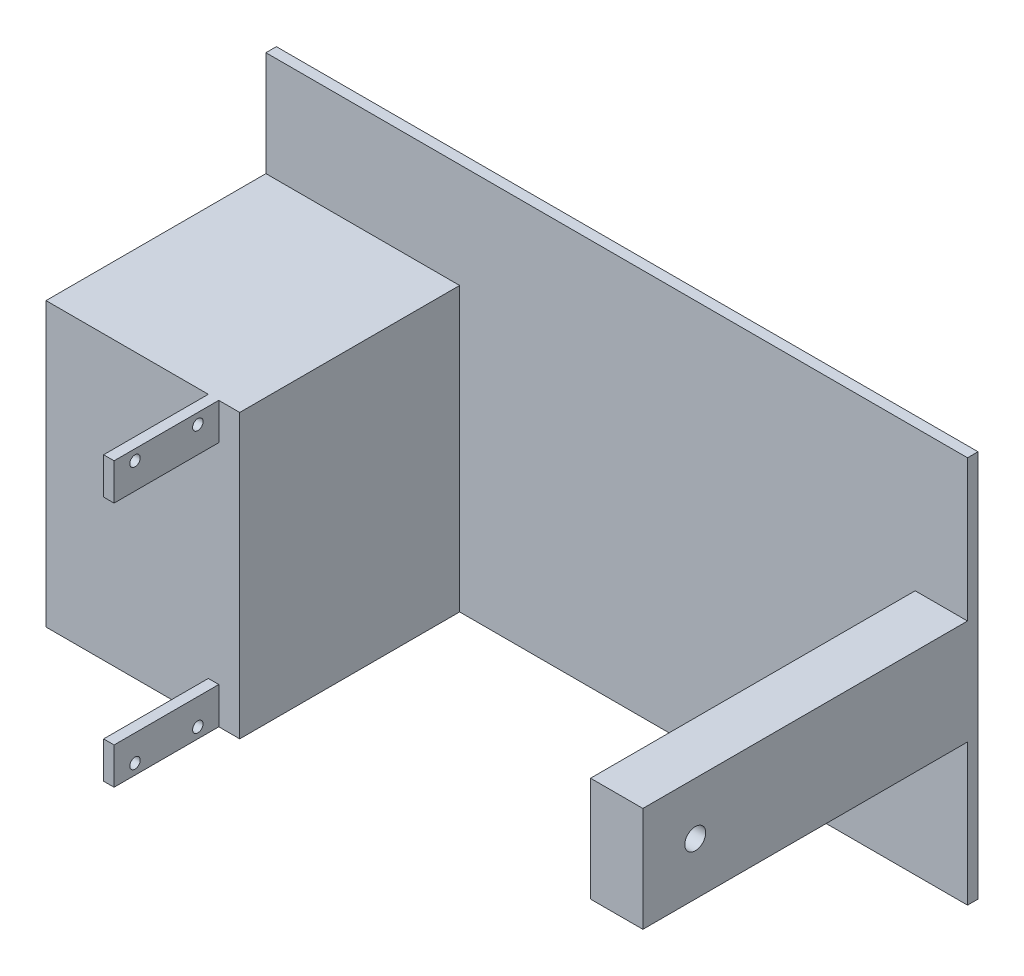
ISO-10303-21;
HEADER;
FILE_DESCRIPTION(('STEP AP214'),'2;1');
FILE_NAME('part.step','',(''),(''),'','','');
FILE_SCHEMA(('AUTOMOTIVE_DESIGN { 1 0 10303 214 1 1 1 1 }'));
ENDSEC;
DATA;
#1=APPLICATION_CONTEXT('core data for automotive mechanical design processes');
#2=APPLICATION_PROTOCOL_DEFINITION('international standard','automotive_design',2000,#1);
#3=PRODUCT_CONTEXT('',#1,'mechanical');
#4=PRODUCT('Part','Part','',(#3));
#5=PRODUCT_RELATED_PRODUCT_CATEGORY('part','',(#4));
#6=PRODUCT_DEFINITION_FORMATION('','',#4);
#7=PRODUCT_DEFINITION_CONTEXT('part definition',#1,'design');
#8=PRODUCT_DEFINITION('design','',#6,#7);
#9=PRODUCT_DEFINITION_SHAPE('','',#8);
#10=(LENGTH_UNIT() NAMED_UNIT(*) SI_UNIT(.MILLI.,.METRE.));
#11=(NAMED_UNIT(*) PLANE_ANGLE_UNIT() SI_UNIT($,.RADIAN.));
#12=(NAMED_UNIT(*) SI_UNIT($,.STERADIAN.) SOLID_ANGLE_UNIT());
#13=UNCERTAINTY_MEASURE_WITH_UNIT(LENGTH_MEASURE(1.E-05),#10,'distance_accuracy_value','');
#14=(GEOMETRIC_REPRESENTATION_CONTEXT(3) GLOBAL_UNCERTAINTY_ASSIGNED_CONTEXT((#13)) GLOBAL_UNIT_ASSIGNED_CONTEXT((#10,
#11,#12)) REPRESENTATION_CONTEXT('',''));
#15=CARTESIAN_POINT('',(0.,0.,0.));
#16=DIRECTION('',(0.,0.,1.));
#17=DIRECTION('',(1.,0.,0.));
#18=AXIS2_PLACEMENT_3D('',#15,#16,#17);
#19=CARTESIAN_POINT('',(0.,0.,-40.));
#20=DIRECTION('',(0.,0.,-1.));
#21=DIRECTION('',(-1.,0.,0.));
#22=AXIS2_PLACEMENT_3D('',#19,#20,#21);
#23=PLANE('',#22);
#24=DIRECTION('',(1.,0.,0.));
#25=VECTOR('',#24,1.);
#26=CARTESIAN_POINT('',(115.5,0.,-40.));
#27=LINE('',#26,#25);
#28=CARTESIAN_POINT('',(105.5,0.,-40.));
#29=VERTEX_POINT('',#28);
#30=CARTESIAN_POINT('',(115.5,0.,-40.));
#31=VERTEX_POINT('',#30);
#32=EDGE_CURVE('E763',#29,#31,#27,.T.);
#33=ORIENTED_EDGE('',*,*,#32,.F.);
#34=DIRECTION('',(0.,-1.,0.));
#35=VECTOR('',#34,1.);
#36=CARTESIAN_POINT('',(105.5,0.,-40.));
#37=LINE('',#36,#35);
#38=CARTESIAN_POINT('',(105.5,20.,-40.));
#39=VERTEX_POINT('',#38);
#40=EDGE_CURVE('E209',#39,#29,#37,.T.);
#41=ORIENTED_EDGE('',*,*,#40,.F.);
#42=DIRECTION('',(-1.,0.,0.));
#43=VECTOR('',#42,1.);
#44=CARTESIAN_POINT('',(115.5,20.,-40.));
#45=LINE('',#44,#43);
#46=CARTESIAN_POINT('',(115.5,20.,-40.));
#47=VERTEX_POINT('',#46);
#48=EDGE_CURVE('E205',#47,#39,#45,.T.);
#49=ORIENTED_EDGE('',*,*,#48,.F.);
#50=DIRECTION('',(0.,-1.,0.));
#51=VECTOR('',#50,1.);
#52=CARTESIAN_POINT('',(115.5,-27.,-40.));
#53=LINE('',#52,#51);
#54=CARTESIAN_POINT('',(115.5,47.,-40.));
#55=VERTEX_POINT('',#54);
#56=EDGE_CURVE('E233',#55,#47,#53,.T.);
#57=ORIENTED_EDGE('',*,*,#56,.F.);
#58=DIRECTION('',(1.,0.,0.));
#59=VECTOR('',#58,1.);
#60=CARTESIAN_POINT('',(-18.5,47.,-40.));
#61=LINE('',#60,#59);
#62=CARTESIAN_POINT('',(-18.5,47.,-40.));
#63=VERTEX_POINT('',#62);
#64=EDGE_CURVE('E213',#63,#55,#61,.T.);
#65=ORIENTED_EDGE('',*,*,#64,.F.);
#66=DIRECTION('',(0.,1.,0.));
#67=VECTOR('',#66,1.);
#68=CARTESIAN_POINT('',(-18.5,-27.,-40.));
#69=LINE('',#68,#67);
#70=CARTESIAN_POINT('',(-18.5,27.,-40.));
#71=VERTEX_POINT('',#70);
#72=EDGE_CURVE('E211',#71,#63,#69,.T.);
#73=ORIENTED_EDGE('',*,*,#72,.F.);
#74=DIRECTION('',(1.,0.,0.));
#75=VECTOR('',#74,1.);
#76=CARTESIAN_POINT('',(18.5,27.,-40.));
#77=LINE('',#76,#75);
#78=CARTESIAN_POINT('',(18.5,27.,-40.));
#79=VERTEX_POINT('',#78);
#80=EDGE_CURVE('E277',#71,#79,#77,.T.);
#81=ORIENTED_EDGE('',*,*,#80,.T.);
#82=DIRECTION('',(0.,-1.,0.));
#83=VECTOR('',#82,1.);
#84=CARTESIAN_POINT('',(18.5,-27.,-40.));
#85=LINE('',#84,#83);
#86=CARTESIAN_POINT('',(18.5,-27.,-40.));
#87=VERTEX_POINT('',#86);
#88=EDGE_CURVE('E280',#79,#87,#85,.T.);
#89=ORIENTED_EDGE('',*,*,#88,.T.);
#90=DIRECTION('',(-1.,0.,0.));
#91=VECTOR('',#90,1.);
#92=CARTESIAN_POINT('',(-18.5,-27.,-40.));
#93=LINE('',#92,#91);
#94=CARTESIAN_POINT('',(115.5,-27.,-40.));
#95=VERTEX_POINT('',#94);
#96=EDGE_CURVE('E223',#95,#87,#93,.T.);
#97=ORIENTED_EDGE('',*,*,#96,.F.);
#98=EDGE_CURVE('E232',#31,#95,#53,.T.);
#99=ORIENTED_EDGE('',*,*,#98,.F.);
#100=EDGE_LOOP('',(#33,#41,#49,#57,#65,#73,#81,#89,#97,#99));
#101=FACE_BOUND('',#100,.T.);
#102=ADVANCED_FACE('F34',(#101),#23,.F.);
#103=CARTESIAN_POINT('',(0.,0.,2.));
#104=DIRECTION('',(0.,0.,-1.));
#105=DIRECTION('',(-1.,0.,0.));
#106=AXIS2_PLACEMENT_3D('',#103,#104,#105);
#107=PLANE('',#106);
#108=DIRECTION('',(0.,-1.,0.));
#109=VECTOR('',#108,1.);
#110=CARTESIAN_POINT('',(12.5,27.,2.));
#111=LINE('',#110,#109);
#112=CARTESIAN_POINT('',(12.5,27.,2.));
#113=VERTEX_POINT('',#112);
#114=CARTESIAN_POINT('',(12.5,20.,2.));
#115=VERTEX_POINT('',#114);
#116=EDGE_CURVE('E307',#113,#115,#111,.T.);
#117=ORIENTED_EDGE('',*,*,#116,.F.);
#118=DIRECTION('',(-1.,0.,0.));
#119=VECTOR('',#118,1.);
#120=CARTESIAN_POINT('',(-18.5,27.,2.));
#121=LINE('',#120,#119);
#122=CARTESIAN_POINT('',(-18.5,27.,2.));
#123=VERTEX_POINT('',#122);
#124=EDGE_CURVE('E370',#113,#123,#121,.T.);
#125=ORIENTED_EDGE('',*,*,#124,.T.);
#126=DIRECTION('',(0.,-1.,0.));
#127=VECTOR('',#126,1.);
#128=CARTESIAN_POINT('',(-18.5,-27.,2.));
#129=LINE('',#128,#127);
#130=CARTESIAN_POINT('',(-18.5,-27.,2.));
#131=VERTEX_POINT('',#130);
#132=EDGE_CURVE('E373',#123,#131,#129,.T.);
#133=ORIENTED_EDGE('',*,*,#132,.T.);
#134=DIRECTION('',(1.,0.,0.));
#135=VECTOR('',#134,1.);
#136=CARTESIAN_POINT('',(-18.5,-27.,2.));
#137=LINE('',#136,#135);
#138=CARTESIAN_POINT('',(12.5,-27.,2.));
#139=VERTEX_POINT('',#138);
#140=EDGE_CURVE('E376',#131,#139,#137,.T.);
#141=ORIENTED_EDGE('',*,*,#140,.T.);
#142=DIRECTION('',(0.,-1.,0.));
#143=VECTOR('',#142,1.);
#144=CARTESIAN_POINT('',(12.5,-27.,2.));
#145=LINE('',#144,#143);
#146=CARTESIAN_POINT('',(12.5,-20.,2.));
#147=VERTEX_POINT('',#146);
#148=EDGE_CURVE('E337',#147,#139,#145,.T.);
#149=ORIENTED_EDGE('',*,*,#148,.F.);
#150=DIRECTION('',(-1.,0.,0.));
#151=VECTOR('',#150,1.);
#152=CARTESIAN_POINT('',(12.5,-20.,2.));
#153=LINE('',#152,#151);
#154=CARTESIAN_POINT('',(14.5,-20.,2.));
#155=VERTEX_POINT('',#154);
#156=EDGE_CURVE('E342',#155,#147,#153,.T.);
#157=ORIENTED_EDGE('',*,*,#156,.F.);
#158=DIRECTION('',(0.,1.,0.));
#159=VECTOR('',#158,1.);
#160=CARTESIAN_POINT('',(14.5,-27.,2.));
#161=LINE('',#160,#159);
#162=CARTESIAN_POINT('',(14.5,-27.,2.));
#163=VERTEX_POINT('',#162);
#164=EDGE_CURVE('E351',#163,#155,#161,.T.);
#165=ORIENTED_EDGE('',*,*,#164,.F.);
#166=CARTESIAN_POINT('',(18.5,-27.,2.));
#167=VERTEX_POINT('',#166);
#168=EDGE_CURVE('E375',#163,#167,#137,.T.);
#169=ORIENTED_EDGE('',*,*,#168,.T.);
#170=DIRECTION('',(0.,1.,0.));
#171=VECTOR('',#170,1.);
#172=CARTESIAN_POINT('',(18.5,-27.,2.));
#173=LINE('',#172,#171);
#174=CARTESIAN_POINT('',(18.5,27.,2.));
#175=VERTEX_POINT('',#174);
#176=EDGE_CURVE('E367',#167,#175,#173,.T.);
#177=ORIENTED_EDGE('',*,*,#176,.T.);
#178=CARTESIAN_POINT('',(14.5,27.,2.));
#179=VERTEX_POINT('',#178);
#180=EDGE_CURVE('E371',#175,#179,#121,.T.);
#181=ORIENTED_EDGE('',*,*,#180,.T.);
#182=DIRECTION('',(0.,1.,0.));
#183=VECTOR('',#182,1.);
#184=CARTESIAN_POINT('',(14.5,27.,2.));
#185=LINE('',#184,#183);
#186=CARTESIAN_POINT('',(14.5,20.,2.));
#187=VERTEX_POINT('',#186);
#188=EDGE_CURVE('E312',#187,#179,#185,.T.);
#189=ORIENTED_EDGE('',*,*,#188,.F.);
#190=DIRECTION('',(1.,0.,0.));
#191=VECTOR('',#190,1.);
#192=CARTESIAN_POINT('',(12.5,20.,2.));
#193=LINE('',#192,#191);
#194=EDGE_CURVE('E321',#115,#187,#193,.T.);
#195=ORIENTED_EDGE('',*,*,#194,.F.);
#196=EDGE_LOOP('',(#117,#125,#133,#141,#149,#157,#165,#169,#177,#181,#189,#195));
#197=FACE_BOUND('',#196,.T.);
#198=ADVANCED_FACE('F413',(#197),#107,.F.);
#199=CARTESIAN_POINT('',(18.5,-27.,2.));
#200=DIRECTION('',(-1.,0.,0.));
#201=DIRECTION('',(0.,0.,1.));
#202=AXIS2_PLACEMENT_3D('',#199,#200,#201);
#203=PLANE('',#202);
#204=DIRECTION('',(0.,0.,-1.));
#205=VECTOR('',#204,1.);
#206=CARTESIAN_POINT('',(18.5,-27.,2.));
#207=LINE('',#206,#205);
#208=EDGE_CURVE('E378',#167,#87,#207,.T.);
#209=ORIENTED_EDGE('',*,*,#208,.T.);
#210=ORIENTED_EDGE('',*,*,#88,.F.);
#211=DIRECTION('',(0.,0.,-1.));
#212=VECTOR('',#211,1.);
#213=CARTESIAN_POINT('',(18.5,27.,2.));
#214=LINE('',#213,#212);
#215=EDGE_CURVE('E11',#175,#79,#214,.T.);
#216=ORIENTED_EDGE('',*,*,#215,.F.);
#217=ORIENTED_EDGE('',*,*,#176,.F.);
#218=EDGE_LOOP('',(#209,#210,#216,#217));
#219=FACE_BOUND('',#218,.T.);
#220=ADVANCED_FACE('F36',(#219),#203,.F.);
#221=CARTESIAN_POINT('',(-18.5,27.,2.));
#222=DIRECTION('',(0.,-1.,0.));
#223=DIRECTION('',(0.,0.,-1.));
#224=AXIS2_PLACEMENT_3D('',#221,#222,#223);
#225=PLANE('',#224);
#226=ORIENTED_EDGE('',*,*,#215,.T.);
#227=ORIENTED_EDGE('',*,*,#80,.F.);
#228=DIRECTION('',(0.,0.,-1.));
#229=VECTOR('',#228,1.);
#230=CARTESIAN_POINT('',(-18.5,27.,2.));
#231=LINE('',#230,#229);
#232=EDGE_CURVE('E43',#123,#71,#231,.T.);
#233=ORIENTED_EDGE('',*,*,#232,.F.);
#234=ORIENTED_EDGE('',*,*,#124,.F.);
#235=DIRECTION('',(0.,0.,-1.));
#236=VECTOR('',#235,1.);
#237=CARTESIAN_POINT('',(12.5,27.,22.));
#238=LINE('',#237,#236);
#239=CARTESIAN_POINT('',(12.5,27.,22.));
#240=VERTEX_POINT('',#239);
#241=EDGE_CURVE('E318',#240,#113,#238,.T.);
#242=ORIENTED_EDGE('',*,*,#241,.F.);
#243=DIRECTION('',(-1.,0.,0.));
#244=VECTOR('',#243,1.);
#245=CARTESIAN_POINT('',(12.5,27.,22.));
#246=LINE('',#245,#244);
#247=CARTESIAN_POINT('',(14.5,27.,22.));
#248=VERTEX_POINT('',#247);
#249=EDGE_CURVE('E316',#248,#240,#246,.T.);
#250=ORIENTED_EDGE('',*,*,#249,.F.);
#251=DIRECTION('',(0.,0.,-1.));
#252=VECTOR('',#251,1.);
#253=CARTESIAN_POINT('',(14.5,27.,22.));
#254=LINE('',#253,#252);
#255=EDGE_CURVE('E328',#248,#179,#254,.T.);
#256=ORIENTED_EDGE('',*,*,#255,.T.);
#257=ORIENTED_EDGE('',*,*,#180,.F.);
#258=EDGE_LOOP('',(#226,#227,#233,#234,#242,#250,#256,#257));
#259=FACE_BOUND('',#258,.T.);
#260=ADVANCED_FACE('F391',(#259),#225,.F.);
#261=CARTESIAN_POINT('',(-18.5,-27.,2.));
#262=DIRECTION('',(1.,0.,0.));
#263=DIRECTION('',(0.,0.,-1.));
#264=AXIS2_PLACEMENT_3D('',#261,#262,#263);
#265=PLANE('',#264);
#266=ORIENTED_EDGE('',*,*,#232,.T.);
#267=ORIENTED_EDGE('',*,*,#72,.T.);
#268=DIRECTION('',(0.,0.,1.));
#269=VECTOR('',#268,1.);
#270=CARTESIAN_POINT('',(-18.5,47.,-42.));
#271=LINE('',#270,#269);
#272=CARTESIAN_POINT('',(-18.5,47.,-42.));
#273=VERTEX_POINT('',#272);
#274=EDGE_CURVE('E243',#273,#63,#271,.T.);
#275=ORIENTED_EDGE('',*,*,#274,.F.);
#276=DIRECTION('',(0.,1.,0.));
#277=VECTOR('',#276,1.);
#278=CARTESIAN_POINT('',(-18.5,-27.,-42.));
#279=LINE('',#278,#277);
#280=CARTESIAN_POINT('',(-18.5,-27.,-42.));
#281=VERTEX_POINT('',#280);
#282=EDGE_CURVE('E219',#281,#273,#279,.T.);
#283=ORIENTED_EDGE('',*,*,#282,.F.);
#284=DIRECTION('',(0.,0.,-1.));
#285=VECTOR('',#284,1.);
#286=CARTESIAN_POINT('',(-18.5,-27.,2.));
#287=LINE('',#286,#285);
#288=EDGE_CURVE('E380',#131,#281,#287,.T.);
#289=ORIENTED_EDGE('',*,*,#288,.F.);
#290=ORIENTED_EDGE('',*,*,#132,.F.);
#291=EDGE_LOOP('',(#266,#267,#275,#283,#289,#290));
#292=FACE_BOUND('',#291,.T.);
#293=ADVANCED_FACE('F385',(#292),#265,.F.);
#294=CARTESIAN_POINT('',(-18.5,-27.,2.));
#295=DIRECTION('',(0.,1.,0.));
#296=DIRECTION('',(0.,0.,1.));
#297=AXIS2_PLACEMENT_3D('',#294,#295,#296);
#298=PLANE('',#297);
#299=ORIENTED_EDGE('',*,*,#288,.T.);
#300=DIRECTION('',(-1.,0.,0.));
#301=VECTOR('',#300,1.);
#302=CARTESIAN_POINT('',(-18.5,-27.,-42.));
#303=LINE('',#302,#301);
#304=CARTESIAN_POINT('',(115.5,-27.,-42.));
#305=VERTEX_POINT('',#304);
#306=EDGE_CURVE('E227',#305,#281,#303,.T.);
#307=ORIENTED_EDGE('',*,*,#306,.F.);
#308=DIRECTION('',(0.,0.,1.));
#309=VECTOR('',#308,1.);
#310=CARTESIAN_POINT('',(115.5,-27.,-42.));
#311=LINE('',#310,#309);
#312=EDGE_CURVE('E229',#305,#95,#311,.T.);
#313=ORIENTED_EDGE('',*,*,#312,.T.);
#314=ORIENTED_EDGE('',*,*,#96,.T.);
#315=ORIENTED_EDGE('',*,*,#208,.F.);
#316=ORIENTED_EDGE('',*,*,#168,.F.);
#317=DIRECTION('',(0.,0.,-1.));
#318=VECTOR('',#317,1.);
#319=CARTESIAN_POINT('',(14.5,-27.,22.));
#320=LINE('',#319,#318);
#321=CARTESIAN_POINT('',(14.5,-27.,22.));
#322=VERTEX_POINT('',#321);
#323=EDGE_CURVE('E361',#322,#163,#320,.T.);
#324=ORIENTED_EDGE('',*,*,#323,.F.);
#325=DIRECTION('',(1.,0.,0.));
#326=VECTOR('',#325,1.);
#327=CARTESIAN_POINT('',(12.5,-27.,22.));
#328=LINE('',#327,#326);
#329=CARTESIAN_POINT('',(12.5,-27.,22.));
#330=VERTEX_POINT('',#329);
#331=EDGE_CURVE('E341',#330,#322,#328,.T.);
#332=ORIENTED_EDGE('',*,*,#331,.F.);
#333=DIRECTION('',(0.,0.,-1.));
#334=VECTOR('',#333,1.);
#335=CARTESIAN_POINT('',(12.5,-27.,22.));
#336=LINE('',#335,#334);
#337=EDGE_CURVE('E364',#330,#139,#336,.T.);
#338=ORIENTED_EDGE('',*,*,#337,.T.);
#339=ORIENTED_EDGE('',*,*,#140,.F.);
#340=EDGE_LOOP('',(#299,#307,#313,#314,#315,#316,#324,#332,#338,#339));
#341=FACE_BOUND('',#340,.T.);
#342=ADVANCED_FACE('F408',(#341),#298,.F.);
#343=CARTESIAN_POINT('',(12.5,-27.,22.));
#344=DIRECTION('',(1.,0.,0.));
#345=DIRECTION('',(0.,0.,-1.));
#346=AXIS2_PLACEMENT_3D('',#343,#344,#345);
#347=PLANE('',#346);
#348=CARTESIAN_POINT('',(12.5,-25.,18.));
#349=DIRECTION('',(-1.,0.,0.));
#350=DIRECTION('',(0.,0.,1.));
#351=AXIS2_PLACEMENT_3D('',#348,#349,#350);
#352=CIRCLE('',#351,1.);
#353=CARTESIAN_POINT('',(12.5,-25.,19.));
#354=VERTEX_POINT('',#353);
#355=EDGE_CURVE('E284',#354,#354,#352,.T.);
#356=ORIENTED_EDGE('',*,*,#355,.F.);
#357=EDGE_LOOP('',(#356));
#358=FACE_BOUND('',#357,.T.);
#359=CARTESIAN_POINT('',(12.5,-25.,6.));
#360=DIRECTION('',(-1.,0.,0.));
#361=DIRECTION('',(0.,0.,1.));
#362=AXIS2_PLACEMENT_3D('',#359,#360,#361);
#363=CIRCLE('',#362,1.);
#364=CARTESIAN_POINT('',(12.5,-25.,7.));
#365=VERTEX_POINT('',#364);
#366=EDGE_CURVE('E291',#365,#365,#363,.T.);
#367=ORIENTED_EDGE('',*,*,#366,.F.);
#368=EDGE_LOOP('',(#367));
#369=FACE_BOUND('',#368,.T.);
#370=ORIENTED_EDGE('',*,*,#148,.T.);
#371=ORIENTED_EDGE('',*,*,#337,.F.);
#372=DIRECTION('',(0.,-1.,0.));
#373=VECTOR('',#372,1.);
#374=CARTESIAN_POINT('',(12.5,-27.,22.));
#375=LINE('',#374,#373);
#376=CARTESIAN_POINT('',(12.5,-20.,22.));
#377=VERTEX_POINT('',#376);
#378=EDGE_CURVE('E338',#377,#330,#375,.T.);
#379=ORIENTED_EDGE('',*,*,#378,.F.);
#380=DIRECTION('',(0.,0.,-1.));
#381=VECTOR('',#380,1.);
#382=CARTESIAN_POINT('',(12.5,-20.,22.));
#383=LINE('',#382,#381);
#384=EDGE_CURVE('E348',#377,#147,#383,.T.);
#385=ORIENTED_EDGE('',*,*,#384,.T.);
#386=EDGE_LOOP('',(#370,#371,#379,#385));
#387=FACE_BOUND('',#386,.T.);
#388=ADVANCED_FACE('F443',(#358,#369,#387),#347,.F.);
#389=CARTESIAN_POINT('',(14.5,-27.,22.));
#390=DIRECTION('',(-1.,0.,0.));
#391=DIRECTION('',(0.,0.,1.));
#392=AXIS2_PLACEMENT_3D('',#389,#390,#391);
#393=PLANE('',#392);
#394=CARTESIAN_POINT('',(14.5,-25.,18.));
#395=DIRECTION('',(-1.,0.,0.));
#396=DIRECTION('',(0.,0.,1.));
#397=AXIS2_PLACEMENT_3D('',#394,#395,#396);
#398=CIRCLE('',#397,1.);
#399=CARTESIAN_POINT('',(14.5,-25.,19.));
#400=VERTEX_POINT('',#399);
#401=EDGE_CURVE('E287',#400,#400,#398,.F.);
#402=ORIENTED_EDGE('',*,*,#401,.F.);
#403=EDGE_LOOP('',(#402));
#404=FACE_BOUND('',#403,.T.);
#405=CARTESIAN_POINT('',(14.5,-25.,6.));
#406=DIRECTION('',(-1.,0.,0.));
#407=DIRECTION('',(0.,0.,1.));
#408=AXIS2_PLACEMENT_3D('',#405,#406,#407);
#409=CIRCLE('',#408,1.);
#410=CARTESIAN_POINT('',(14.5,-25.,7.));
#411=VERTEX_POINT('',#410);
#412=EDGE_CURVE('E304',#411,#411,#409,.F.);
#413=ORIENTED_EDGE('',*,*,#412,.F.);
#414=EDGE_LOOP('',(#413));
#415=FACE_BOUND('',#414,.T.);
#416=ORIENTED_EDGE('',*,*,#164,.T.);
#417=DIRECTION('',(0.,0.,-1.));
#418=VECTOR('',#417,1.);
#419=CARTESIAN_POINT('',(14.5,-20.,22.));
#420=LINE('',#419,#418);
#421=CARTESIAN_POINT('',(14.5,-20.,22.));
#422=VERTEX_POINT('',#421);
#423=EDGE_CURVE('E358',#422,#155,#420,.T.);
#424=ORIENTED_EDGE('',*,*,#423,.F.);
#425=DIRECTION('',(0.,1.,0.));
#426=VECTOR('',#425,1.);
#427=CARTESIAN_POINT('',(14.5,-27.,22.));
#428=LINE('',#427,#426);
#429=EDGE_CURVE('E344',#322,#422,#428,.T.);
#430=ORIENTED_EDGE('',*,*,#429,.F.);
#431=ORIENTED_EDGE('',*,*,#323,.T.);
#432=EDGE_LOOP('',(#416,#424,#430,#431));
#433=FACE_BOUND('',#432,.T.);
#434=ADVANCED_FACE('F435',(#404,#415,#433),#393,.F.);
#435=CARTESIAN_POINT('',(12.5,-20.,22.));
#436=DIRECTION('',(0.,-1.,0.));
#437=DIRECTION('',(0.,0.,-1.));
#438=AXIS2_PLACEMENT_3D('',#435,#436,#437);
#439=PLANE('',#438);
#440=ORIENTED_EDGE('',*,*,#156,.T.);
#441=ORIENTED_EDGE('',*,*,#384,.F.);
#442=DIRECTION('',(-1.,0.,0.));
#443=VECTOR('',#442,1.);
#444=CARTESIAN_POINT('',(12.5,-20.,22.));
#445=LINE('',#444,#443);
#446=EDGE_CURVE('E346',#422,#377,#445,.T.);
#447=ORIENTED_EDGE('',*,*,#446,.F.);
#448=ORIENTED_EDGE('',*,*,#423,.T.);
#449=EDGE_LOOP('',(#440,#441,#447,#448));
#450=FACE_BOUND('',#449,.T.);
#451=ADVANCED_FACE('F445',(#450),#439,.F.);
#452=CARTESIAN_POINT('',(0.,0.,22.));
#453=DIRECTION('',(0.,0.,-1.));
#454=DIRECTION('',(-1.,0.,0.));
#455=AXIS2_PLACEMENT_3D('',#452,#453,#454);
#456=PLANE('',#455);
#457=ORIENTED_EDGE('',*,*,#378,.T.);
#458=ORIENTED_EDGE('',*,*,#331,.T.);
#459=ORIENTED_EDGE('',*,*,#429,.T.);
#460=ORIENTED_EDGE('',*,*,#446,.T.);
#461=EDGE_LOOP('',(#457,#458,#459,#460));
#462=FACE_BOUND('',#461,.T.);
#463=ADVANCED_FACE('F439',(#462),#456,.F.);
#464=CARTESIAN_POINT('',(12.5,27.,22.));
#465=DIRECTION('',(1.,0.,0.));
#466=DIRECTION('',(0.,1.,0.));
#467=AXIS2_PLACEMENT_3D('',#464,#465,#466);
#468=PLANE('',#467);
#469=CARTESIAN_POINT('',(12.5,25.,6.));
#470=DIRECTION('',(-1.,0.,0.));
#471=DIRECTION('',(0.,0.,1.));
#472=AXIS2_PLACEMENT_3D('',#469,#470,#471);
#473=CIRCLE('',#472,1.);
#474=CARTESIAN_POINT('',(12.5,25.,7.));
#475=VERTEX_POINT('',#474);
#476=EDGE_CURVE('E292',#475,#475,#473,.T.);
#477=ORIENTED_EDGE('',*,*,#476,.F.);
#478=EDGE_LOOP('',(#477));
#479=FACE_BOUND('',#478,.T.);
#480=CARTESIAN_POINT('',(12.5,25.,18.));
#481=DIRECTION('',(-1.,0.,0.));
#482=DIRECTION('',(0.,0.,1.));
#483=AXIS2_PLACEMENT_3D('',#480,#481,#482);
#484=CIRCLE('',#483,1.);
#485=CARTESIAN_POINT('',(12.5,25.,19.));
#486=VERTEX_POINT('',#485);
#487=EDGE_CURVE('E283',#486,#486,#484,.T.);
#488=ORIENTED_EDGE('',*,*,#487,.F.);
#489=EDGE_LOOP('',(#488));
#490=FACE_BOUND('',#489,.T.);
#491=ORIENTED_EDGE('',*,*,#116,.T.);
#492=DIRECTION('',(0.,0.,-1.));
#493=VECTOR('',#492,1.);
#494=CARTESIAN_POINT('',(12.5,20.,22.));
#495=LINE('',#494,#493);
#496=CARTESIAN_POINT('',(12.5,20.,22.));
#497=VERTEX_POINT('',#496);
#498=EDGE_CURVE('E334',#497,#115,#495,.T.);
#499=ORIENTED_EDGE('',*,*,#498,.F.);
#500=DIRECTION('',(0.,-1.,0.));
#501=VECTOR('',#500,1.);
#502=CARTESIAN_POINT('',(12.5,27.,22.));
#503=LINE('',#502,#501);
#504=EDGE_CURVE('E308',#240,#497,#503,.T.);
#505=ORIENTED_EDGE('',*,*,#504,.F.);
#506=ORIENTED_EDGE('',*,*,#241,.T.);
#507=EDGE_LOOP('',(#491,#499,#505,#506));
#508=FACE_BOUND('',#507,.T.);
#509=ADVANCED_FACE('F419',(#479,#490,#508),#468,.F.);
#510=CARTESIAN_POINT('',(12.5,20.,22.));
#511=DIRECTION('',(0.,1.,0.));
#512=DIRECTION('',(0.,0.,1.));
#513=AXIS2_PLACEMENT_3D('',#510,#511,#512);
#514=PLANE('',#513);
#515=ORIENTED_EDGE('',*,*,#194,.T.);
#516=DIRECTION('',(0.,0.,-1.));
#517=VECTOR('',#516,1.);
#518=CARTESIAN_POINT('',(14.5,20.,22.));
#519=LINE('',#518,#517);
#520=CARTESIAN_POINT('',(14.5,20.,22.));
#521=VERTEX_POINT('',#520);
#522=EDGE_CURVE('E331',#521,#187,#519,.T.);
#523=ORIENTED_EDGE('',*,*,#522,.F.);
#524=DIRECTION('',(1.,0.,0.));
#525=VECTOR('',#524,1.);
#526=CARTESIAN_POINT('',(12.5,20.,22.));
#527=LINE('',#526,#525);
#528=EDGE_CURVE('E311',#497,#521,#527,.T.);
#529=ORIENTED_EDGE('',*,*,#528,.F.);
#530=ORIENTED_EDGE('',*,*,#498,.T.);
#531=EDGE_LOOP('',(#515,#523,#529,#530));
#532=FACE_BOUND('',#531,.T.);
#533=ADVANCED_FACE('F520',(#532),#514,.F.);
#534=CARTESIAN_POINT('',(14.5,27.,22.));
#535=DIRECTION('',(-1.,0.,0.));
#536=DIRECTION('',(0.,-1.,0.));
#537=AXIS2_PLACEMENT_3D('',#534,#535,#536);
#538=PLANE('',#537);
#539=CARTESIAN_POINT('',(14.5,25.,6.));
#540=DIRECTION('',(-1.,0.,0.));
#541=DIRECTION('',(0.,-1.,0.));
#542=AXIS2_PLACEMENT_3D('',#539,#540,#541);
#543=CIRCLE('',#542,1.);
#544=CARTESIAN_POINT('',(14.5,24.,6.));
#545=VERTEX_POINT('',#544);
#546=EDGE_CURVE('E288',#545,#545,#543,.F.);
#547=ORIENTED_EDGE('',*,*,#546,.F.);
#548=EDGE_LOOP('',(#547));
#549=FACE_BOUND('',#548,.T.);
#550=CARTESIAN_POINT('',(14.5,25.,18.));
#551=DIRECTION('',(-1.,0.,0.));
#552=DIRECTION('',(0.,-1.,0.));
#553=AXIS2_PLACEMENT_3D('',#550,#551,#552);
#554=CIRCLE('',#553,1.);
#555=CARTESIAN_POINT('',(14.5,24.,18.));
#556=VERTEX_POINT('',#555);
#557=EDGE_CURVE('E295',#556,#556,#554,.F.);
#558=ORIENTED_EDGE('',*,*,#557,.F.);
#559=EDGE_LOOP('',(#558));
#560=FACE_BOUND('',#559,.T.);
#561=ORIENTED_EDGE('',*,*,#188,.T.);
#562=ORIENTED_EDGE('',*,*,#255,.F.);
#563=DIRECTION('',(0.,1.,0.));
#564=VECTOR('',#563,1.);
#565=CARTESIAN_POINT('',(14.5,27.,22.));
#566=LINE('',#565,#564);
#567=EDGE_CURVE('E314',#521,#248,#566,.T.);
#568=ORIENTED_EDGE('',*,*,#567,.F.);
#569=ORIENTED_EDGE('',*,*,#522,.T.);
#570=EDGE_LOOP('',(#561,#562,#568,#569));
#571=FACE_BOUND('',#570,.T.);
#572=ADVANCED_FACE('F426',(#549,#560,#571),#538,.F.);
#573=CARTESIAN_POINT('',(0.,0.,22.));
#574=DIRECTION('',(0.,0.,1.));
#575=DIRECTION('',(1.,0.,0.));
#576=AXIS2_PLACEMENT_3D('',#573,#574,#575);
#577=PLANE('',#576);
#578=ORIENTED_EDGE('',*,*,#504,.T.);
#579=ORIENTED_EDGE('',*,*,#528,.T.);
#580=ORIENTED_EDGE('',*,*,#567,.T.);
#581=ORIENTED_EDGE('',*,*,#249,.T.);
#582=EDGE_LOOP('',(#578,#579,#580,#581));
#583=FACE_BOUND('',#582,.T.);
#584=ADVANCED_FACE('F421',(#583),#577,.T.);
#585=CARTESIAN_POINT('',(18.501,-25.,6.));
#586=DIRECTION('',(-1.,0.,0.));
#587=DIRECTION('',(0.,0.,1.));
#588=AXIS2_PLACEMENT_3D('',#585,#586,#587);
#589=CYLINDRICAL_SURFACE('',#588,1.);
#590=ORIENTED_EDGE('',*,*,#366,.T.);
#591=EDGE_LOOP('',(#590));
#592=FACE_BOUND('',#591,.T.);
#593=ORIENTED_EDGE('',*,*,#412,.T.);
#594=EDGE_LOOP('',(#593));
#595=FACE_BOUND('',#594,.T.);
#596=ADVANCED_FACE('F536',(#592,#595),#589,.F.);
#597=CARTESIAN_POINT('',(18.501,25.,18.));
#598=DIRECTION('',(-1.,0.,0.));
#599=DIRECTION('',(0.,0.,1.));
#600=AXIS2_PLACEMENT_3D('',#597,#598,#599);
#601=CYLINDRICAL_SURFACE('',#600,1.);
#602=ORIENTED_EDGE('',*,*,#487,.T.);
#603=EDGE_LOOP('',(#602));
#604=FACE_BOUND('',#603,.T.);
#605=ORIENTED_EDGE('',*,*,#557,.T.);
#606=EDGE_LOOP('',(#605));
#607=FACE_BOUND('',#606,.T.);
#608=ADVANCED_FACE('F573',(#604,#607),#601,.F.);
#609=CARTESIAN_POINT('',(18.501,25.,6.));
#610=DIRECTION('',(-1.,0.,0.));
#611=DIRECTION('',(0.,0.,1.));
#612=AXIS2_PLACEMENT_3D('',#609,#610,#611);
#613=CYLINDRICAL_SURFACE('',#612,1.);
#614=ORIENTED_EDGE('',*,*,#476,.T.);
#615=EDGE_LOOP('',(#614));
#616=FACE_BOUND('',#615,.T.);
#617=ORIENTED_EDGE('',*,*,#546,.T.);
#618=EDGE_LOOP('',(#617));
#619=FACE_BOUND('',#618,.T.);
#620=ADVANCED_FACE('F583',(#616,#619),#613,.F.);
#621=CARTESIAN_POINT('',(18.501,-25.,18.));
#622=DIRECTION('',(-1.,0.,0.));
#623=DIRECTION('',(0.,0.,1.));
#624=AXIS2_PLACEMENT_3D('',#621,#622,#623);
#625=CYLINDRICAL_SURFACE('',#624,1.);
#626=ORIENTED_EDGE('',*,*,#355,.T.);
#627=EDGE_LOOP('',(#626));
#628=FACE_BOUND('',#627,.T.);
#629=ORIENTED_EDGE('',*,*,#401,.T.);
#630=EDGE_LOOP('',(#629));
#631=FACE_BOUND('',#630,.T.);
#632=ADVANCED_FACE('F593',(#628,#631),#625,.F.);
#633=CARTESIAN_POINT('',(-18.5,47.,-42.));
#634=DIRECTION('',(0.,-1.,0.));
#635=DIRECTION('',(1.,0.,0.));
#636=AXIS2_PLACEMENT_3D('',#633,#634,#635);
#637=PLANE('',#636);
#638=ORIENTED_EDGE('',*,*,#64,.T.);
#639=DIRECTION('',(0.,0.,1.));
#640=VECTOR('',#639,1.);
#641=CARTESIAN_POINT('',(115.5,47.,-42.));
#642=LINE('',#641,#640);
#643=CARTESIAN_POINT('',(115.5,47.,-42.));
#644=VERTEX_POINT('',#643);
#645=EDGE_CURVE('E240',#644,#55,#642,.T.);
#646=ORIENTED_EDGE('',*,*,#645,.F.);
#647=DIRECTION('',(1.,0.,0.));
#648=VECTOR('',#647,1.);
#649=CARTESIAN_POINT('',(-18.5,47.,-42.));
#650=LINE('',#649,#648);
#651=EDGE_CURVE('E222',#273,#644,#650,.T.);
#652=ORIENTED_EDGE('',*,*,#651,.F.);
#653=ORIENTED_EDGE('',*,*,#274,.T.);
#654=EDGE_LOOP('',(#638,#646,#652,#653));
#655=FACE_BOUND('',#654,.T.);
#656=ADVANCED_FACE('F399',(#655),#637,.F.);
#657=CARTESIAN_POINT('',(115.5,-27.,-42.));
#658=DIRECTION('',(-1.,0.,0.));
#659=DIRECTION('',(0.,0.,1.));
#660=AXIS2_PLACEMENT_3D('',#657,#658,#659);
#661=PLANE('',#660);
#662=CARTESIAN_POINT('',(115.5,9.99999999999997,12.));
#663=DIRECTION('',(1.,0.,0.));
#664=DIRECTION('',(0.,0.,-1.));
#665=AXIS2_PLACEMENT_3D('',#662,#663,#664);
#666=CIRCLE('',#665,2.);
#667=CARTESIAN_POINT('',(115.5,9.99999999999997,10.));
#668=VERTEX_POINT('',#667);
#669=EDGE_CURVE('E758',#668,#668,#666,.T.);
#670=ORIENTED_EDGE('',*,*,#669,.F.);
#671=EDGE_LOOP('',(#670));
#672=FACE_BOUND('',#671,.T.);
#673=ORIENTED_EDGE('',*,*,#56,.T.);
#674=DIRECTION('',(0.,0.,-1.));
#675=VECTOR('',#674,1.);
#676=CARTESIAN_POINT('',(115.5,20.,22.));
#677=LINE('',#676,#675);
#678=CARTESIAN_POINT('',(115.5,20.,22.));
#679=VERTEX_POINT('',#678);
#680=EDGE_CURVE('E215',#679,#47,#677,.T.);
#681=ORIENTED_EDGE('',*,*,#680,.F.);
#682=DIRECTION('',(0.,1.,0.));
#683=VECTOR('',#682,1.);
#684=CARTESIAN_POINT('',(115.5,20.,22.));
#685=LINE('',#684,#683);
#686=CARTESIAN_POINT('',(115.5,0.,22.));
#687=VERTEX_POINT('',#686);
#688=EDGE_CURVE('E195',#687,#679,#685,.T.);
#689=ORIENTED_EDGE('',*,*,#688,.F.);
#690=DIRECTION('',(0.,0.,-1.));
#691=VECTOR('',#690,1.);
#692=CARTESIAN_POINT('',(115.5,0.,22.));
#693=LINE('',#692,#691);
#694=EDGE_CURVE('E50',#687,#31,#693,.T.);
#695=ORIENTED_EDGE('',*,*,#694,.T.);
#696=ORIENTED_EDGE('',*,*,#98,.T.);
#697=ORIENTED_EDGE('',*,*,#312,.F.);
#698=DIRECTION('',(0.,-1.,0.));
#699=VECTOR('',#698,1.);
#700=CARTESIAN_POINT('',(115.5,-27.,-42.));
#701=LINE('',#700,#699);
#702=EDGE_CURVE('E225',#644,#305,#701,.T.);
#703=ORIENTED_EDGE('',*,*,#702,.F.);
#704=ORIENTED_EDGE('',*,*,#645,.T.);
#705=EDGE_LOOP('',(#673,#681,#689,#695,#696,#697,#703,#704));
#706=FACE_BOUND('',#705,.T.);
#707=ADVANCED_FACE('F654',(#672,#706),#661,.F.);
#708=CARTESIAN_POINT('',(0.,0.,-42.));
#709=DIRECTION('',(0.,0.,-1.));
#710=DIRECTION('',(-1.,0.,0.));
#711=AXIS2_PLACEMENT_3D('',#708,#709,#710);
#712=PLANE('',#711);
#713=ORIENTED_EDGE('',*,*,#282,.T.);
#714=ORIENTED_EDGE('',*,*,#651,.T.);
#715=ORIENTED_EDGE('',*,*,#702,.T.);
#716=ORIENTED_EDGE('',*,*,#306,.T.);
#717=EDGE_LOOP('',(#713,#714,#715,#716));
#718=FACE_BOUND('',#717,.T.);
#719=ADVANCED_FACE('F403',(#718),#712,.T.);
#720=CARTESIAN_POINT('',(105.5,0.,22.));
#721=DIRECTION('',(1.,0.,0.));
#722=DIRECTION('',(0.,0.,-1.));
#723=AXIS2_PLACEMENT_3D('',#720,#721,#722);
#724=PLANE('',#723);
#725=CARTESIAN_POINT('',(105.5,9.99999999999997,12.));
#726=DIRECTION('',(1.,0.,0.));
#727=DIRECTION('',(0.,0.,-1.));
#728=AXIS2_PLACEMENT_3D('',#725,#726,#727);
#729=CIRCLE('',#728,2.);
#730=CARTESIAN_POINT('',(105.5,9.99999999999997,10.));
#731=VERTEX_POINT('',#730);
#732=EDGE_CURVE('E761',#731,#731,#729,.F.);
#733=ORIENTED_EDGE('',*,*,#732,.F.);
#734=EDGE_LOOP('',(#733));
#735=FACE_BOUND('',#734,.T.);
#736=ORIENTED_EDGE('',*,*,#40,.T.);
#737=DIRECTION('',(0.,0.,-1.));
#738=VECTOR('',#737,1.);
#739=CARTESIAN_POINT('',(105.5,0.,22.));
#740=LINE('',#739,#738);
#741=CARTESIAN_POINT('',(105.5,0.,22.));
#742=VERTEX_POINT('',#741);
#743=EDGE_CURVE('E192',#742,#29,#740,.T.);
#744=ORIENTED_EDGE('',*,*,#743,.F.);
#745=DIRECTION('',(0.,-1.,0.));
#746=VECTOR('',#745,1.);
#747=CARTESIAN_POINT('',(105.5,0.,22.));
#748=LINE('',#747,#746);
#749=CARTESIAN_POINT('',(105.5,20.,22.));
#750=VERTEX_POINT('',#749);
#751=EDGE_CURVE('E196',#750,#742,#748,.T.);
#752=ORIENTED_EDGE('',*,*,#751,.F.);
#753=DIRECTION('',(0.,0.,-1.));
#754=VECTOR('',#753,1.);
#755=CARTESIAN_POINT('',(105.5,20.,22.));
#756=LINE('',#755,#754);
#757=EDGE_CURVE('E768',#750,#39,#756,.T.);
#758=ORIENTED_EDGE('',*,*,#757,.T.);
#759=EDGE_LOOP('',(#736,#744,#752,#758));
#760=FACE_BOUND('',#759,.T.);
#761=ADVANCED_FACE('F207',(#735,#760),#724,.F.);
#762=CARTESIAN_POINT('',(115.5,0.,22.));
#763=DIRECTION('',(0.,1.,0.));
#764=DIRECTION('',(-1.,0.,0.));
#765=AXIS2_PLACEMENT_3D('',#762,#763,#764);
#766=PLANE('',#765);
#767=ORIENTED_EDGE('',*,*,#32,.T.);
#768=ORIENTED_EDGE('',*,*,#694,.F.);
#769=DIRECTION('',(1.,0.,0.));
#770=VECTOR('',#769,1.);
#771=CARTESIAN_POINT('',(115.5,0.,22.));
#772=LINE('',#771,#770);
#773=EDGE_CURVE('E188',#742,#687,#772,.T.);
#774=ORIENTED_EDGE('',*,*,#773,.F.);
#775=ORIENTED_EDGE('',*,*,#743,.T.);
#776=EDGE_LOOP('',(#767,#768,#774,#775));
#777=FACE_BOUND('',#776,.T.);
#778=ADVANCED_FACE('F190',(#777),#766,.F.);
#779=CARTESIAN_POINT('',(115.5,20.,22.));
#780=DIRECTION('',(0.,-1.,0.));
#781=DIRECTION('',(1.,0.,0.));
#782=AXIS2_PLACEMENT_3D('',#779,#780,#781);
#783=PLANE('',#782);
#784=ORIENTED_EDGE('',*,*,#48,.T.);
#785=ORIENTED_EDGE('',*,*,#757,.F.);
#786=DIRECTION('',(-1.,0.,0.));
#787=VECTOR('',#786,1.);
#788=CARTESIAN_POINT('',(115.5,20.,22.));
#789=LINE('',#788,#787);
#790=EDGE_CURVE('E201',#679,#750,#789,.T.);
#791=ORIENTED_EDGE('',*,*,#790,.F.);
#792=ORIENTED_EDGE('',*,*,#680,.T.);
#793=EDGE_LOOP('',(#784,#785,#791,#792));
#794=FACE_BOUND('',#793,.T.);
#795=ADVANCED_FACE('F711',(#794),#783,.F.);
#796=CARTESIAN_POINT('',(0.,0.,22.));
#797=DIRECTION('',(0.,0.,1.));
#798=DIRECTION('',(1.,0.,0.));
#799=AXIS2_PLACEMENT_3D('',#796,#797,#798);
#800=PLANE('',#799);
#801=ORIENTED_EDGE('',*,*,#751,.T.);
#802=ORIENTED_EDGE('',*,*,#773,.T.);
#803=ORIENTED_EDGE('',*,*,#688,.T.);
#804=ORIENTED_EDGE('',*,*,#790,.T.);
#805=EDGE_LOOP('',(#801,#802,#803,#804));
#806=FACE_BOUND('',#805,.T.);
#807=ADVANCED_FACE('F199',(#806),#800,.T.);
#808=CARTESIAN_POINT('',(-18.501,9.99999999999997,12.));
#809=DIRECTION('',(1.,0.,0.));
#810=DIRECTION('',(0.,0.,-1.));
#811=AXIS2_PLACEMENT_3D('',#808,#809,#810);
#812=CYLINDRICAL_SURFACE('',#811,2.);
#813=ORIENTED_EDGE('',*,*,#669,.T.);
#814=EDGE_LOOP('',(#813));
#815=FACE_BOUND('',#814,.T.);
#816=ORIENTED_EDGE('',*,*,#732,.T.);
#817=EDGE_LOOP('',(#816));
#818=FACE_BOUND('',#817,.T.);
#819=ADVANCED_FACE('F730',(#815,#818),#812,.F.);
#820=CLOSED_SHELL('',(#102,#198,#220,#260,#293,#342,#388,#434,#451,#463,#509,#533,#572,#584,
#596,#608,#620,#632,#656,#707,#719,#761,#778,#795,#807,#819));
#821=CARTESIAN_POINT('',(0.,0.,0.));
#822=DIRECTION('',(0.,0.,-1.));
#823=DIRECTION('',(-1.,0.,0.));
#824=AXIS2_PLACEMENT_3D('',#821,#822,#823);
#825=PLANE('',#824);
#826=DIRECTION('',(0.,1.,0.));
#827=VECTOR('',#826,1.);
#828=CARTESIAN_POINT('',(-16.5,-25.,0.));
#829=LINE('',#828,#827);
#830=CARTESIAN_POINT('',(-16.5,-25.,0.));
#831=VERTEX_POINT('',#830);
#832=CARTESIAN_POINT('',(-16.5,25.,0.));
#833=VERTEX_POINT('',#832);
#834=EDGE_CURVE('E58',#831,#833,#829,.T.);
#835=ORIENTED_EDGE('',*,*,#834,.T.);
#836=DIRECTION('',(1.,0.,0.));
#837=VECTOR('',#836,1.);
#838=CARTESIAN_POINT('',(16.5,25.,0.));
#839=LINE('',#838,#837);
#840=CARTESIAN_POINT('',(16.5,25.,0.));
#841=VERTEX_POINT('',#840);
#842=EDGE_CURVE('E261',#833,#841,#839,.T.);
#843=ORIENTED_EDGE('',*,*,#842,.T.);
#844=DIRECTION('',(0.,-1.,0.));
#845=VECTOR('',#844,1.);
#846=CARTESIAN_POINT('',(16.5,-25.,0.));
#847=LINE('',#846,#845);
#848=CARTESIAN_POINT('',(16.5,-25.,0.));
#849=VERTEX_POINT('',#848);
#850=EDGE_CURVE('E263',#841,#849,#847,.T.);
#851=ORIENTED_EDGE('',*,*,#850,.T.);
#852=DIRECTION('',(-1.,0.,0.));
#853=VECTOR('',#852,1.);
#854=CARTESIAN_POINT('',(16.5,-25.,0.));
#855=LINE('',#854,#853);
#856=EDGE_CURVE('E250',#849,#831,#855,.T.);
#857=ORIENTED_EDGE('',*,*,#856,.T.);
#858=EDGE_LOOP('',(#835,#843,#851,#857));
#859=FACE_BOUND('',#858,.T.);
#860=ADVANCED_FACE('F474',(#859),#825,.T.);
#861=CARTESIAN_POINT('',(16.5,25.,-40.));
#862=DIRECTION('',(0.,-1.,0.));
#863=DIRECTION('',(0.,0.,-1.));
#864=AXIS2_PLACEMENT_3D('',#861,#862,#863);
#865=PLANE('',#864);
#866=ORIENTED_EDGE('',*,*,#842,.F.);
#867=DIRECTION('',(0.,0.,1.));
#868=VECTOR('',#867,1.);
#869=CARTESIAN_POINT('',(-16.5,25.,-40.));
#870=LINE('',#869,#868);
#871=CARTESIAN_POINT('',(-16.5,25.,-40.));
#872=VERTEX_POINT('',#871);
#873=EDGE_CURVE('E274',#872,#833,#870,.T.);
#874=ORIENTED_EDGE('',*,*,#873,.F.);
#875=DIRECTION('',(1.,0.,0.));
#876=VECTOR('',#875,1.);
#877=CARTESIAN_POINT('',(16.5,25.,-40.));
#878=LINE('',#877,#876);
#879=CARTESIAN_POINT('',(16.5,25.,-40.));
#880=VERTEX_POINT('',#879);
#881=EDGE_CURVE('E249',#872,#880,#878,.T.);
#882=ORIENTED_EDGE('',*,*,#881,.T.);
#883=DIRECTION('',(0.,0.,1.));
#884=VECTOR('',#883,1.);
#885=CARTESIAN_POINT('',(16.5,25.,-40.));
#886=LINE('',#885,#884);
#887=EDGE_CURVE('E271',#880,#841,#886,.T.);
#888=ORIENTED_EDGE('',*,*,#887,.T.);
#889=EDGE_LOOP('',(#866,#874,#882,#888));
#890=FACE_BOUND('',#889,.T.);
#891=ADVANCED_FACE('F476',(#890),#865,.T.);
#892=CARTESIAN_POINT('',(16.5,-25.,-40.));
#893=DIRECTION('',(-1.,0.,0.));
#894=DIRECTION('',(0.,0.,1.));
#895=AXIS2_PLACEMENT_3D('',#892,#893,#894);
#896=PLANE('',#895);
#897=ORIENTED_EDGE('',*,*,#850,.F.);
#898=ORIENTED_EDGE('',*,*,#887,.F.);
#899=DIRECTION('',(0.,-1.,0.));
#900=VECTOR('',#899,1.);
#901=CARTESIAN_POINT('',(16.5,-25.,-40.));
#902=LINE('',#901,#900);
#903=CARTESIAN_POINT('',(16.5,-25.,-40.));
#904=VERTEX_POINT('',#903);
#905=EDGE_CURVE('E253',#880,#904,#902,.T.);
#906=ORIENTED_EDGE('',*,*,#905,.T.);
#907=DIRECTION('',(0.,0.,1.));
#908=VECTOR('',#907,1.);
#909=CARTESIAN_POINT('',(16.5,-25.,-40.));
#910=LINE('',#909,#908);
#911=EDGE_CURVE('E268',#904,#849,#910,.T.);
#912=ORIENTED_EDGE('',*,*,#911,.T.);
#913=EDGE_LOOP('',(#897,#898,#906,#912));
#914=FACE_BOUND('',#913,.T.);
#915=ADVANCED_FACE('F482',(#914),#896,.T.);
#916=CARTESIAN_POINT('',(16.5,-25.,-40.));
#917=DIRECTION('',(0.,1.,0.));
#918=DIRECTION('',(0.,0.,1.));
#919=AXIS2_PLACEMENT_3D('',#916,#917,#918);
#920=PLANE('',#919);
#921=ORIENTED_EDGE('',*,*,#856,.F.);
#922=ORIENTED_EDGE('',*,*,#911,.F.);
#923=DIRECTION('',(-1.,0.,0.));
#924=VECTOR('',#923,1.);
#925=CARTESIAN_POINT('',(16.5,-25.,-40.));
#926=LINE('',#925,#924);
#927=CARTESIAN_POINT('',(-16.5,-25.,-40.));
#928=VERTEX_POINT('',#927);
#929=EDGE_CURVE('E256',#904,#928,#926,.T.);
#930=ORIENTED_EDGE('',*,*,#929,.T.);
#931=DIRECTION('',(0.,0.,1.));
#932=VECTOR('',#931,1.);
#933=CARTESIAN_POINT('',(-16.5,-25.,-40.));
#934=LINE('',#933,#932);
#935=EDGE_CURVE('E259',#928,#831,#934,.T.);
#936=ORIENTED_EDGE('',*,*,#935,.T.);
#937=EDGE_LOOP('',(#921,#922,#930,#936));
#938=FACE_BOUND('',#937,.T.);
#939=ADVANCED_FACE('F471',(#938),#920,.T.);
#940=CARTESIAN_POINT('',(-16.5,-25.,-40.));
#941=DIRECTION('',(1.,0.,0.));
#942=DIRECTION('',(0.,0.,-1.));
#943=AXIS2_PLACEMENT_3D('',#940,#941,#942);
#944=PLANE('',#943);
#945=ORIENTED_EDGE('',*,*,#834,.F.);
#946=ORIENTED_EDGE('',*,*,#935,.F.);
#947=DIRECTION('',(0.,1.,0.));
#948=VECTOR('',#947,1.);
#949=CARTESIAN_POINT('',(-16.5,-25.,-40.));
#950=LINE('',#949,#948);
#951=EDGE_CURVE('E246',#928,#872,#950,.T.);
#952=ORIENTED_EDGE('',*,*,#951,.T.);
#953=ORIENTED_EDGE('',*,*,#873,.T.);
#954=EDGE_LOOP('',(#945,#946,#952,#953));
#955=FACE_BOUND('',#954,.T.);
#956=ADVANCED_FACE('F465',(#955),#944,.T.);
#957=ORIENTED_EDGE('',*,*,#951,.F.);
#958=ORIENTED_EDGE('',*,*,#929,.F.);
#959=ORIENTED_EDGE('',*,*,#905,.F.);
#960=ORIENTED_EDGE('',*,*,#881,.F.);
#961=EDGE_LOOP('',(#957,#958,#959,#960));
#962=FACE_BOUND('',#961,.T.);
#963=ADVANCED_FACE('F457',(#962),#23,.F.);
#964=CLOSED_SHELL('',(#860,#891,#915,#939,#956,#963));
#965=ORIENTED_CLOSED_SHELL('',*,#964,.T.);
#966=BREP_WITH_VOIDS('B2',#820,(#965));
#967=ADVANCED_BREP_SHAPE_REPRESENTATION('',(#18,#966),#14);
#968=SHAPE_DEFINITION_REPRESENTATION(#9,#967);
ENDSEC;
END-ISO-10303-21;
